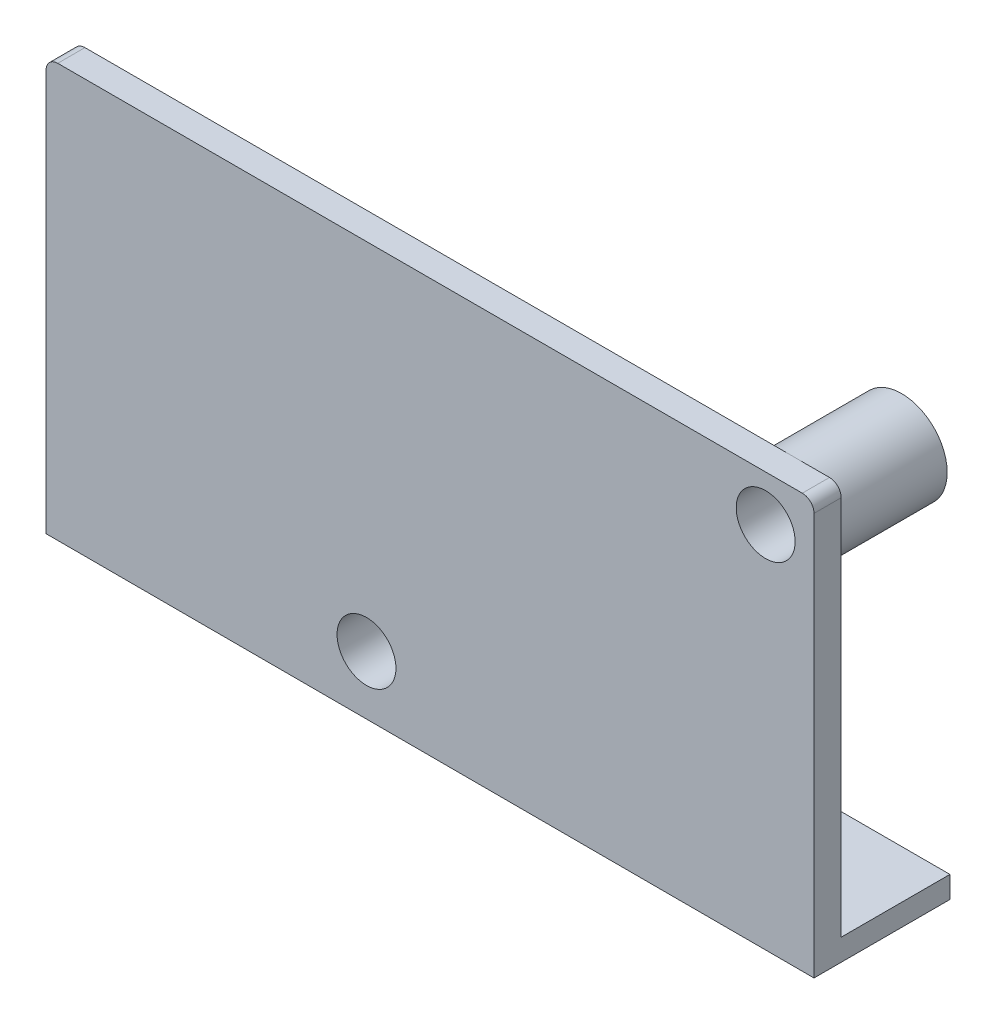
ISO-10303-21;
HEADER;
FILE_DESCRIPTION(('STEP AP214'),'2;1');
FILE_NAME('part.step','',(''),(''),'','','');
FILE_SCHEMA(('AUTOMOTIVE_DESIGN { 1 0 10303 214 1 1 1 1 }'));
ENDSEC;
DATA;
#1=APPLICATION_CONTEXT('core data for automotive mechanical design processes');
#2=APPLICATION_PROTOCOL_DEFINITION('international standard','automotive_design',2000,#1);
#3=PRODUCT_CONTEXT('',#1,'mechanical');
#4=PRODUCT('Part','Part','',(#3));
#5=PRODUCT_RELATED_PRODUCT_CATEGORY('part','',(#4));
#6=PRODUCT_DEFINITION_FORMATION('','',#4);
#7=PRODUCT_DEFINITION_CONTEXT('part definition',#1,'design');
#8=PRODUCT_DEFINITION('design','',#6,#7);
#9=PRODUCT_DEFINITION_SHAPE('','',#8);
#10=(LENGTH_UNIT() NAMED_UNIT(*) SI_UNIT(.MILLI.,.METRE.));
#11=(NAMED_UNIT(*) PLANE_ANGLE_UNIT() SI_UNIT($,.RADIAN.));
#12=(NAMED_UNIT(*) SI_UNIT($,.STERADIAN.) SOLID_ANGLE_UNIT());
#13=UNCERTAINTY_MEASURE_WITH_UNIT(LENGTH_MEASURE(1.E-05),#10,'distance_accuracy_value','');
#14=(GEOMETRIC_REPRESENTATION_CONTEXT(3) GLOBAL_UNCERTAINTY_ASSIGNED_CONTEXT((#13)) GLOBAL_UNIT_ASSIGNED_CONTEXT((#10,
#11,#12)) REPRESENTATION_CONTEXT('',''));
#15=CARTESIAN_POINT('',(0.,0.,0.));
#16=DIRECTION('',(0.,0.,1.));
#17=DIRECTION('',(1.,0.,0.));
#18=AXIS2_PLACEMENT_3D('',#15,#16,#17);
#19=CARTESIAN_POINT('',(-37.3701242161152,-9.39429744441578,-12.5));
#20=DIRECTION('',(0.,-1.,0.));
#21=DIRECTION('',(1.,0.,0.));
#22=AXIS2_PLACEMENT_3D('',#19,#20,#21);
#23=PLANE('',#22);
#24=DIRECTION('',(1.,0.,0.));
#25=VECTOR('',#24,1.);
#26=CARTESIAN_POINT('',(-37.3701242161152,-9.39429744441578,-12.5));
#27=LINE('',#26,#25);
#28=CARTESIAN_POINT('',(-5.50182376053479,-9.39429744441579,-12.5));
#29=VERTEX_POINT('',#28);
#30=CARTESIAN_POINT('',(33.2418757838848,-9.39429744441579,-12.5));
#31=VERTEX_POINT('',#30);
#32=EDGE_CURVE('E217',#29,#31,#27,.T.);
#33=ORIENTED_EDGE('',*,*,#32,.F.);
#34=DIRECTION('',(0.,0.,1.));
#35=VECTOR('',#34,1.);
#36=CARTESIAN_POINT('',(-5.50182376053479,-9.39429744441579,-12.5));
#37=LINE('',#36,#35);
#38=CARTESIAN_POINT('',(-5.50182376053479,-9.39429744441579,-2.5));
#39=VERTEX_POINT('',#38);
#40=EDGE_CURVE('E210',#29,#39,#37,.T.);
#41=ORIENTED_EDGE('',*,*,#40,.T.);
#42=DIRECTION('',(1.,0.,0.));
#43=VECTOR('',#42,1.);
#44=CARTESIAN_POINT('',(-37.3701242161152,-9.39429744441578,-2.5));
#45=LINE('',#44,#43);
#46=CARTESIAN_POINT('',(33.2418757838848,-9.39429744441579,-2.5));
#47=VERTEX_POINT('',#46);
#48=EDGE_CURVE('E228',#39,#47,#45,.T.);
#49=ORIENTED_EDGE('',*,*,#48,.T.);
#50=DIRECTION('',(0.,0.,1.));
#51=VECTOR('',#50,1.);
#52=CARTESIAN_POINT('',(33.2418757838848,-9.39429744441579,-12.5));
#53=LINE('',#52,#51);
#54=EDGE_CURVE('E236',#31,#47,#53,.T.);
#55=ORIENTED_EDGE('',*,*,#54,.F.);
#56=EDGE_LOOP('',(#33,#41,#49,#55));
#57=FACE_BOUND('',#56,.T.);
#58=ADVANCED_FACE('F35',(#57),#23,.F.);
#59=CARTESIAN_POINT('',(-36.2951962161152,25.6013105555092,-2.5));
#60=DIRECTION('',(0.,0.,1.));
#61=DIRECTION('',(1.,0.,0.));
#62=AXIS2_PLACEMENT_3D('',#59,#60,#61);
#63=CYLINDRICAL_SURFACE('',#62,1.07492800007502);
#64=CARTESIAN_POINT('',(-36.2951962161152,25.6013105555092,0.));
#65=DIRECTION('',(0.,0.,1.));
#66=DIRECTION('',(-1.,0.,0.));
#67=AXIS2_PLACEMENT_3D('',#64,#65,#66);
#68=CIRCLE('',#67,1.07492800007502);
#69=CARTESIAN_POINT('',(-36.2951962161152,26.6762385555842,0.));
#70=VERTEX_POINT('',#69);
#71=CARTESIAN_POINT('',(-37.3701242161152,25.6012978555842,0.));
#72=VERTEX_POINT('',#71);
#73=EDGE_CURVE('E149',#70,#72,#68,.T.);
#74=ORIENTED_EDGE('',*,*,#73,.F.);
#75=DIRECTION('',(0.,0.,1.));
#76=VECTOR('',#75,1.);
#77=CARTESIAN_POINT('',(-36.2951962161152,26.6762385555842,-2.5));
#78=LINE('',#77,#76);
#79=CARTESIAN_POINT('',(-36.2951962161152,26.6762385555842,-2.5));
#80=VERTEX_POINT('',#79);
#81=EDGE_CURVE('E11',#80,#70,#78,.T.);
#82=ORIENTED_EDGE('',*,*,#81,.F.);
#83=CARTESIAN_POINT('',(-36.2951962161152,25.6013105555092,-2.5));
#84=DIRECTION('',(0.,0.,1.));
#85=DIRECTION('',(-1.,0.,0.));
#86=AXIS2_PLACEMENT_3D('',#83,#84,#85);
#87=CIRCLE('',#86,1.07492800007502);
#88=CARTESIAN_POINT('',(-37.3701242161152,25.6012978555842,-2.5));
#89=VERTEX_POINT('',#88);
#90=EDGE_CURVE('E143',#80,#89,#87,.T.);
#91=ORIENTED_EDGE('',*,*,#90,.T.);
#92=DIRECTION('',(0.,0.,1.));
#93=VECTOR('',#92,1.);
#94=CARTESIAN_POINT('',(-37.3701242161152,25.6012978555842,-2.5));
#95=LINE('',#94,#93);
#96=EDGE_CURVE('E136',#89,#72,#95,.T.);
#97=ORIENTED_EDGE('',*,*,#96,.T.);
#98=EDGE_LOOP('',(#74,#82,#91,#97));
#99=FACE_BOUND('',#98,.T.);
#100=ADVANCED_FACE('F37',(#99),#63,.T.);
#101=CARTESIAN_POINT('',(-36.2951962161152,26.6762385555842,-2.5));
#102=DIRECTION('',(0.,1.,0.));
#103=DIRECTION('',(0.,0.,1.));
#104=AXIS2_PLACEMENT_3D('',#101,#102,#103);
#105=PLANE('',#104);
#106=ORIENTED_EDGE('',*,*,#81,.T.);
#107=DIRECTION('',(-1.,0.,0.));
#108=VECTOR('',#107,1.);
#109=CARTESIAN_POINT('',(-36.2951962161152,26.6762385555842,0.));
#110=LINE('',#109,#108);
#111=CARTESIAN_POINT('',(32.1669477838848,26.6762385555842,0.));
#112=VERTEX_POINT('',#111);
#113=EDGE_CURVE('E165',#112,#70,#110,.T.);
#114=ORIENTED_EDGE('',*,*,#113,.F.);
#115=DIRECTION('',(0.,0.,1.));
#116=VECTOR('',#115,1.);
#117=CARTESIAN_POINT('',(32.1669477838848,26.6762385555842,-2.5));
#118=LINE('',#117,#116);
#119=CARTESIAN_POINT('',(32.1669477838848,26.6762385555842,-2.5));
#120=VERTEX_POINT('',#119);
#121=EDGE_CURVE('E44',#120,#112,#118,.T.);
#122=ORIENTED_EDGE('',*,*,#121,.F.);
#123=DIRECTION('',(-1.,0.,0.));
#124=VECTOR('',#123,1.);
#125=CARTESIAN_POINT('',(-36.2951962161152,26.6762385555842,-2.5));
#126=LINE('',#125,#124);
#127=CARTESIAN_POINT('',(28.7968757838848,26.6762385555842,-2.5));
#128=VERTEX_POINT('',#127);
#129=EDGE_CURVE('E127',#120,#128,#126,.T.);
#130=ORIENTED_EDGE('',*,*,#129,.T.);
#131=EDGE_CURVE('E130',#128,#80,#126,.T.);
#132=ORIENTED_EDGE('',*,*,#131,.T.);
#133=EDGE_LOOP('',(#106,#114,#122,#130,#132));
#134=FACE_BOUND('',#133,.T.);
#135=ADVANCED_FACE('F129',(#134),#105,.T.);
#136=CARTESIAN_POINT('',(32.1669477838848,25.6013105555842,-2.5));
#137=DIRECTION('',(0.,0.,1.));
#138=DIRECTION('',(1.,0.,0.));
#139=AXIS2_PLACEMENT_3D('',#136,#137,#138);
#140=CYLINDRICAL_SURFACE('',#139,1.07492799999999);
#141=CARTESIAN_POINT('',(32.1669477838848,25.6013105555842,0.));
#142=DIRECTION('',(0.,0.,1.));
#143=DIRECTION('',(-1.,0.,0.));
#144=AXIS2_PLACEMENT_3D('',#141,#142,#143);
#145=CIRCLE('',#144,1.07492799999999);
#146=CARTESIAN_POINT('',(33.2418757838848,25.6013105555842,0.));
#147=VERTEX_POINT('',#146);
#148=EDGE_CURVE('E162',#147,#112,#145,.T.);
#149=ORIENTED_EDGE('',*,*,#148,.F.);
#150=DIRECTION('',(0.,0.,1.));
#151=VECTOR('',#150,1.);
#152=CARTESIAN_POINT('',(33.2418757838848,25.6013105555842,-2.5));
#153=LINE('',#152,#151);
#154=CARTESIAN_POINT('',(33.2418757838848,25.6013105555842,-2.5));
#155=VERTEX_POINT('',#154);
#156=EDGE_CURVE('E168',#155,#147,#153,.T.);
#157=ORIENTED_EDGE('',*,*,#156,.F.);
#158=CARTESIAN_POINT('',(32.1669477838848,25.6013105555842,-2.5));
#159=DIRECTION('',(0.,0.,1.));
#160=DIRECTION('',(-1.,0.,0.));
#161=AXIS2_PLACEMENT_3D('',#158,#159,#160);
#162=CIRCLE('',#161,1.07492799999999);
#163=EDGE_CURVE('E144',#155,#120,#162,.T.);
#164=ORIENTED_EDGE('',*,*,#163,.T.);
#165=ORIENTED_EDGE('',*,*,#121,.T.);
#166=EDGE_LOOP('',(#149,#157,#164,#165));
#167=FACE_BOUND('',#166,.T.);
#168=ADVANCED_FACE('F256',(#167),#140,.T.);
#169=CARTESIAN_POINT('',(33.2418757838848,25.6013105555842,-2.5));
#170=DIRECTION('',(1.,0.,0.));
#171=DIRECTION('',(0.,0.,-1.));
#172=AXIS2_PLACEMENT_3D('',#169,#170,#171);
#173=PLANE('',#172);
#174=DIRECTION('',(0.,1.,0.));
#175=VECTOR('',#174,1.);
#176=CARTESIAN_POINT('',(33.2418757838848,25.6013105555842,0.));
#177=LINE('',#176,#175);
#178=CARTESIAN_POINT('',(33.2418757838848,-11.3942974444158,0.));
#179=VERTEX_POINT('',#178);
#180=EDGE_CURVE('E159',#179,#147,#177,.T.);
#181=ORIENTED_EDGE('',*,*,#180,.F.);
#182=DIRECTION('',(0.,0.,1.));
#183=VECTOR('',#182,1.);
#184=CARTESIAN_POINT('',(33.2418757838848,-11.3942974444158,-2.5));
#185=LINE('',#184,#183);
#186=CARTESIAN_POINT('',(33.2418757838848,-11.3942974444158,-2.5));
#187=VERTEX_POINT('',#186);
#188=EDGE_CURVE('E170',#187,#179,#185,.T.);
#189=ORIENTED_EDGE('',*,*,#188,.F.);
#190=DIRECTION('',(0.,0.,1.));
#191=VECTOR('',#190,1.);
#192=CARTESIAN_POINT('',(33.2418757838848,-11.3942974444158,-12.5));
#193=LINE('',#192,#191);
#194=CARTESIAN_POINT('',(33.2418757838848,-11.3942974444158,-12.5));
#195=VERTEX_POINT('',#194);
#196=EDGE_CURVE('E233',#195,#187,#193,.T.);
#197=ORIENTED_EDGE('',*,*,#196,.F.);
#198=DIRECTION('',(0.,-1.,0.));
#199=VECTOR('',#198,1.);
#200=CARTESIAN_POINT('',(33.2418757838848,-9.39429744441579,-12.5));
#201=LINE('',#200,#199);
#202=EDGE_CURVE('E221',#31,#195,#201,.T.);
#203=ORIENTED_EDGE('',*,*,#202,.F.);
#204=ORIENTED_EDGE('',*,*,#54,.T.);
#205=DIRECTION('',(0.,1.,0.));
#206=VECTOR('',#205,1.);
#207=CARTESIAN_POINT('',(33.2418757838848,25.6013105555842,-2.5));
#208=LINE('',#207,#206);
#209=EDGE_CURVE('E145',#47,#155,#208,.T.);
#210=ORIENTED_EDGE('',*,*,#209,.T.);
#211=ORIENTED_EDGE('',*,*,#156,.T.);
#212=EDGE_LOOP('',(#181,#189,#197,#203,#204,#210,#211));
#213=FACE_BOUND('',#212,.T.);
#214=ADVANCED_FACE('F250',(#213),#173,.T.);
#215=CARTESIAN_POINT('',(-37.3701242161152,-11.3205612444158,-2.5));
#216=DIRECTION('',(-0.0010442440349705,-0.999999454777049,0.));
#217=DIRECTION('',(0.999999454777049,-0.0010442440349705,0.));
#218=AXIS2_PLACEMENT_3D('',#215,#216,#217);
#219=PLANE('',#218);
#220=DIRECTION('',(0.999999454777049,-0.0010442440349705,0.));
#221=VECTOR('',#220,1.);
#222=CARTESIAN_POINT('',(-37.3701242161152,-11.3205612444158,0.));
#223=LINE('',#222,#221);
#224=CARTESIAN_POINT('',(-37.3701242161152,-11.3205612444158,0.));
#225=VERTEX_POINT('',#224);
#226=EDGE_CURVE('E156',#225,#179,#223,.T.);
#227=ORIENTED_EDGE('',*,*,#226,.F.);
#228=DIRECTION('',(0.,0.,1.));
#229=VECTOR('',#228,1.);
#230=CARTESIAN_POINT('',(-37.3701242161152,-11.3205612444158,-2.5));
#231=LINE('',#230,#229);
#232=CARTESIAN_POINT('',(-37.3701242161152,-11.3205612444158,-2.5));
#233=VERTEX_POINT('',#232);
#234=EDGE_CURVE('E172',#233,#225,#231,.T.);
#235=ORIENTED_EDGE('',*,*,#234,.F.);
#236=DIRECTION('',(0.999999454777049,-0.0010442440349705,0.));
#237=VECTOR('',#236,1.);
#238=CARTESIAN_POINT('',(-37.3701242161152,-11.3205612444158,-2.5));
#239=LINE('',#238,#237);
#240=EDGE_CURVE('E244',#233,#187,#239,.T.);
#241=ORIENTED_EDGE('',*,*,#240,.T.);
#242=ORIENTED_EDGE('',*,*,#188,.T.);
#243=EDGE_LOOP('',(#227,#235,#241,#242));
#244=FACE_BOUND('',#243,.T.);
#245=ADVANCED_FACE('F264',(#244),#219,.T.);
#246=CARTESIAN_POINT('',(-37.3701242161152,-11.3205612444158,-2.5));
#247=DIRECTION('',(-1.,0.,0.));
#248=DIRECTION('',(0.,0.,1.));
#249=AXIS2_PLACEMENT_3D('',#246,#247,#248);
#250=PLANE('',#249);
#251=DIRECTION('',(0.,-1.,0.));
#252=VECTOR('',#251,1.);
#253=CARTESIAN_POINT('',(-37.3701242161152,-11.3205612444158,0.));
#254=LINE('',#253,#252);
#255=EDGE_CURVE('E152',#72,#225,#254,.T.);
#256=ORIENTED_EDGE('',*,*,#255,.F.);
#257=ORIENTED_EDGE('',*,*,#96,.F.);
#258=DIRECTION('',(0.,-1.,0.));
#259=VECTOR('',#258,1.);
#260=CARTESIAN_POINT('',(-37.3701242161152,-11.3205612444158,-2.5));
#261=LINE('',#260,#259);
#262=CARTESIAN_POINT('',(-37.3701242161152,-9.39429744441579,-2.5));
#263=VERTEX_POINT('',#262);
#264=EDGE_CURVE('E242',#89,#263,#261,.T.);
#265=ORIENTED_EDGE('',*,*,#264,.T.);
#266=DIRECTION('',(0.,0.,1.));
#267=VECTOR('',#266,1.);
#268=CARTESIAN_POINT('',(-37.3701242161152,-9.39429744441578,-12.5));
#269=LINE('',#268,#267);
#270=CARTESIAN_POINT('',(-37.3701242161152,-9.39429744441578,-12.5));
#271=VERTEX_POINT('',#270);
#272=EDGE_CURVE('E153',#271,#263,#269,.T.);
#273=ORIENTED_EDGE('',*,*,#272,.F.);
#274=DIRECTION('',(0.,1.,0.));
#275=VECTOR('',#274,1.);
#276=CARTESIAN_POINT('',(-37.3701242161152,-9.39429744441578,-12.5));
#277=LINE('',#276,#275);
#278=CARTESIAN_POINT('',(-37.3701242161152,-11.3942974444158,-12.5));
#279=VERTEX_POINT('',#278);
#280=EDGE_CURVE('E214',#279,#271,#277,.T.);
#281=ORIENTED_EDGE('',*,*,#280,.F.);
#282=DIRECTION('',(0.,0.,1.));
#283=VECTOR('',#282,1.);
#284=CARTESIAN_POINT('',(-37.3701242161152,-11.3942974444158,-12.5));
#285=LINE('',#284,#283);
#286=CARTESIAN_POINT('',(-37.3701242161152,-11.3942974444158,-2.5));
#287=VERTEX_POINT('',#286);
#288=EDGE_CURVE('E225',#279,#287,#285,.T.);
#289=ORIENTED_EDGE('',*,*,#288,.T.);
#290=DIRECTION('',(0.,1.,0.));
#291=VECTOR('',#290,1.);
#292=CARTESIAN_POINT('',(-37.3701242161152,-9.39429744441578,-2.5));
#293=LINE('',#292,#291);
#294=EDGE_CURVE('E213',#287,#233,#293,.T.);
#295=ORIENTED_EDGE('',*,*,#294,.T.);
#296=ORIENTED_EDGE('',*,*,#234,.T.);
#297=EDGE_LOOP('',(#256,#257,#265,#273,#281,#289,#295,#296));
#298=FACE_BOUND('',#297,.T.);
#299=ADVANCED_FACE('F274',(#298),#250,.T.);
#300=CARTESIAN_POINT('',(-36.2951962161152,25.6013105555092,-2.5));
#301=DIRECTION('',(0.,0.,-1.));
#302=DIRECTION('',(-1.,0.,0.));
#303=AXIS2_PLACEMENT_3D('',#300,#301,#302);
#304=PLANE('',#303);
#305=ORIENTED_EDGE('',*,*,#131,.F.);
#306=CARTESIAN_POINT('',(28.7968757838848,22.4852385555842,-2.5));
#307=DIRECTION('',(0.,0.,-1.));
#308=DIRECTION('',(-1.,0.,0.));
#309=AXIS2_PLACEMENT_3D('',#306,#307,#308);
#310=CIRCLE('',#309,4.191);
#311=EDGE_CURVE('E141',#128,#128,#310,.T.);
#312=ORIENTED_EDGE('',*,*,#311,.F.);
#313=ORIENTED_EDGE('',*,*,#129,.F.);
#314=ORIENTED_EDGE('',*,*,#163,.F.);
#315=ORIENTED_EDGE('',*,*,#209,.F.);
#316=ORIENTED_EDGE('',*,*,#48,.F.);
#317=CARTESIAN_POINT('',(-7.90612421611517,-5.96276144441579,-2.5));
#318=DIRECTION('',(0.,0.,-1.));
#319=DIRECTION('',(-1.,0.,0.));
#320=AXIS2_PLACEMENT_3D('',#317,#318,#319);
#321=CIRCLE('',#320,4.19);
#322=CARTESIAN_POINT('',(-10.3104246716956,-9.39429744441579,-2.5));
#323=VERTEX_POINT('',#322);
#324=EDGE_CURVE('E208',#323,#39,#321,.T.);
#325=ORIENTED_EDGE('',*,*,#324,.F.);
#326=EDGE_CURVE('E60',#263,#323,#45,.T.);
#327=ORIENTED_EDGE('',*,*,#326,.F.);
#328=ORIENTED_EDGE('',*,*,#264,.F.);
#329=ORIENTED_EDGE('',*,*,#90,.F.);
#330=EDGE_LOOP('',(#305,#312,#313,#314,#315,#316,#325,#327,#328,#329));
#331=FACE_BOUND('',#330,.T.);
#332=ADVANCED_FACE('F139',(#331),#304,.T.);
#333=CARTESIAN_POINT('',(-36.2951962161152,25.6013105555092,0.));
#334=DIRECTION('',(0.,0.,-1.));
#335=DIRECTION('',(-1.,0.,0.));
#336=AXIS2_PLACEMENT_3D('',#333,#334,#335);
#337=PLANE('',#336);
#338=CARTESIAN_POINT('',(-7.90612421611517,-5.96276144441579,0.));
#339=DIRECTION('',(0.,0.,1.));
#340=DIRECTION('',(1.,0.,0.));
#341=AXIS2_PLACEMENT_3D('',#338,#339,#340);
#342=CIRCLE('',#341,2.7083489);
#343=CARTESIAN_POINT('',(-5.19777531611517,-5.96276144441579,0.));
#344=VERTEX_POINT('',#343);
#345=EDGE_CURVE('E193',#344,#344,#342,.T.);
#346=ORIENTED_EDGE('',*,*,#345,.F.);
#347=EDGE_LOOP('',(#346));
#348=FACE_BOUND('',#347,.T.);
#349=CARTESIAN_POINT('',(28.7968757838848,22.4852385555842,0.));
#350=DIRECTION('',(0.,0.,1.));
#351=DIRECTION('',(1.,0.,0.));
#352=AXIS2_PLACEMENT_3D('',#349,#350,#351);
#353=CIRCLE('',#352,2.708349387292);
#354=CARTESIAN_POINT('',(31.5052251711768,22.4852385555842,0.));
#355=VERTEX_POINT('',#354);
#356=EDGE_CURVE('E188',#355,#355,#353,.T.);
#357=ORIENTED_EDGE('',*,*,#356,.F.);
#358=EDGE_LOOP('',(#357));
#359=FACE_BOUND('',#358,.T.);
#360=ORIENTED_EDGE('',*,*,#113,.T.);
#361=ORIENTED_EDGE('',*,*,#73,.T.);
#362=ORIENTED_EDGE('',*,*,#255,.T.);
#363=ORIENTED_EDGE('',*,*,#226,.T.);
#364=ORIENTED_EDGE('',*,*,#180,.T.);
#365=ORIENTED_EDGE('',*,*,#148,.T.);
#366=EDGE_LOOP('',(#360,#361,#362,#363,#364,#365));
#367=FACE_BOUND('',#366,.T.);
#368=ADVANCED_FACE('F258',(#348,#359,#367),#337,.F.);
#369=CARTESIAN_POINT('',(0.,0.,-2.5));
#370=DIRECTION('',(0.,0.,1.));
#371=DIRECTION('',(1.,0.,0.));
#372=AXIS2_PLACEMENT_3D('',#369,#370,#371);
#373=PLANE('',#372);
#374=ORIENTED_EDGE('',*,*,#240,.F.);
#375=ORIENTED_EDGE('',*,*,#294,.F.);
#376=DIRECTION('',(-1.,0.,0.));
#377=VECTOR('',#376,1.);
#378=CARTESIAN_POINT('',(-37.3701242161152,-11.3942974444158,-2.5));
#379=LINE('',#378,#377);
#380=EDGE_CURVE('E218',#187,#287,#379,.T.);
#381=ORIENTED_EDGE('',*,*,#380,.F.);
#382=EDGE_LOOP('',(#374,#375,#381));
#383=FACE_BOUND('',#382,.T.);
#384=ADVANCED_FACE('F271',(#383),#373,.T.);
#385=ORIENTED_EDGE('',*,*,#326,.T.);
#386=DIRECTION('',(0.,0.,1.));
#387=VECTOR('',#386,1.);
#388=CARTESIAN_POINT('',(-10.3104246716956,-9.39429744441579,-12.5));
#389=LINE('',#388,#387);
#390=CARTESIAN_POINT('',(-10.3104246716956,-9.39429744441579,-12.5));
#391=VERTEX_POINT('',#390);
#392=EDGE_CURVE('E205',#323,#391,#389,.F.);
#393=ORIENTED_EDGE('',*,*,#392,.T.);
#394=EDGE_CURVE('E219',#271,#391,#27,.T.);
#395=ORIENTED_EDGE('',*,*,#394,.F.);
#396=ORIENTED_EDGE('',*,*,#272,.T.);
#397=EDGE_LOOP('',(#385,#393,#395,#396));
#398=FACE_BOUND('',#397,.T.);
#399=ADVANCED_FACE('F282',(#398),#23,.F.);
#400=CARTESIAN_POINT('',(-37.3701242161152,-11.3942974444158,-12.5));
#401=DIRECTION('',(0.,1.,0.));
#402=DIRECTION('',(0.,0.,1.));
#403=AXIS2_PLACEMENT_3D('',#400,#401,#402);
#404=PLANE('',#403);
#405=ORIENTED_EDGE('',*,*,#380,.T.);
#406=ORIENTED_EDGE('',*,*,#288,.F.);
#407=DIRECTION('',(-1.,0.,0.));
#408=VECTOR('',#407,1.);
#409=CARTESIAN_POINT('',(-37.3701242161152,-11.3942974444158,-12.5));
#410=LINE('',#409,#408);
#411=EDGE_CURVE('E223',#195,#279,#410,.T.);
#412=ORIENTED_EDGE('',*,*,#411,.F.);
#413=ORIENTED_EDGE('',*,*,#196,.T.);
#414=EDGE_LOOP('',(#405,#406,#412,#413));
#415=FACE_BOUND('',#414,.T.);
#416=ADVANCED_FACE('F269',(#415),#404,.F.);
#417=CARTESIAN_POINT('',(0.,0.,-12.5));
#418=DIRECTION('',(0.,0.,1.));
#419=DIRECTION('',(1.,0.,0.));
#420=AXIS2_PLACEMENT_3D('',#417,#418,#419);
#421=PLANE('',#420);
#422=CARTESIAN_POINT('',(-7.90612421611517,-5.96276144441579,-12.5));
#423=DIRECTION('',(0.,0.,1.));
#424=DIRECTION('',(1.,0.,0.));
#425=AXIS2_PLACEMENT_3D('',#422,#423,#424);
#426=CIRCLE('',#425,1.65);
#427=CARTESIAN_POINT('',(-6.25612421611517,-5.96276144441579,-12.5));
#428=VERTEX_POINT('',#427);
#429=EDGE_CURVE('E176',#428,#428,#426,.T.);
#430=ORIENTED_EDGE('',*,*,#429,.T.);
#431=EDGE_LOOP('',(#430));
#432=FACE_BOUND('',#431,.T.);
#433=ORIENTED_EDGE('',*,*,#394,.T.);
#434=CARTESIAN_POINT('',(-7.90612421611517,-5.96276144441579,-12.5));
#435=DIRECTION('',(0.,0.,1.));
#436=DIRECTION('',(1.,0.,0.));
#437=AXIS2_PLACEMENT_3D('',#434,#435,#436);
#438=CIRCLE('',#437,4.19);
#439=EDGE_CURVE('E52',#29,#391,#438,.T.);
#440=ORIENTED_EDGE('',*,*,#439,.F.);
#441=ORIENTED_EDGE('',*,*,#32,.T.);
#442=ORIENTED_EDGE('',*,*,#202,.T.);
#443=ORIENTED_EDGE('',*,*,#411,.T.);
#444=ORIENTED_EDGE('',*,*,#280,.T.);
#445=EDGE_LOOP('',(#433,#440,#441,#442,#443,#444));
#446=FACE_BOUND('',#445,.T.);
#447=ADVANCED_FACE('F277',(#432,#446),#421,.F.);
#448=CARTESIAN_POINT('',(-7.90612421611517,-5.96276144441579,-12.5));
#449=DIRECTION('',(0.,0.,1.));
#450=DIRECTION('',(1.,0.,0.));
#451=AXIS2_PLACEMENT_3D('',#448,#449,#450);
#452=CYLINDRICAL_SURFACE('',#451,4.19);
#453=ORIENTED_EDGE('',*,*,#40,.F.);
#454=ORIENTED_EDGE('',*,*,#439,.T.);
#455=ORIENTED_EDGE('',*,*,#392,.F.);
#456=ORIENTED_EDGE('',*,*,#324,.T.);
#457=EDGE_LOOP('',(#453,#454,#455,#456));
#458=FACE_BOUND('',#457,.T.);
#459=ADVANCED_FACE('F283',(#458),#452,.T.);
#460=CARTESIAN_POINT('',(28.7968757838848,22.4852385555842,-12.5));
#461=DIRECTION('',(0.,0.,1.));
#462=DIRECTION('',(1.,0.,0.));
#463=AXIS2_PLACEMENT_3D('',#460,#461,#462);
#464=CYLINDRICAL_SURFACE('',#463,4.191);
#465=ORIENTED_EDGE('',*,*,#311,.T.);
#466=EDGE_LOOP('',(#465));
#467=FACE_BOUND('',#466,.T.);
#468=CARTESIAN_POINT('',(28.7968757838848,22.4852385555842,-12.5));
#469=DIRECTION('',(0.,0.,1.));
#470=DIRECTION('',(1.,0.,0.));
#471=AXIS2_PLACEMENT_3D('',#468,#469,#470);
#472=CIRCLE('',#471,4.191);
#473=CARTESIAN_POINT('',(32.9878757838848,22.4852385555842,-12.5));
#474=VERTEX_POINT('',#473);
#475=EDGE_CURVE('E192',#474,#474,#472,.T.);
#476=ORIENTED_EDGE('',*,*,#475,.T.);
#477=EDGE_LOOP('',(#476));
#478=FACE_BOUND('',#477,.T.);
#479=ADVANCED_FACE('F285',(#467,#478),#464,.T.);
#480=CARTESIAN_POINT('',(28.7968757838848,22.4852385555842,-12.5));
#481=DIRECTION('',(0.,0.,1.));
#482=DIRECTION('',(1.,0.,0.));
#483=AXIS2_PLACEMENT_3D('',#480,#481,#482);
#484=PLANE('',#483);
#485=CARTESIAN_POINT('',(28.7968757838848,22.4852385555842,-12.5));
#486=DIRECTION('',(0.,0.,1.));
#487=DIRECTION('',(1.,0.,0.));
#488=AXIS2_PLACEMENT_3D('',#485,#486,#487);
#489=CIRCLE('',#488,1.65);
#490=CARTESIAN_POINT('',(30.4468757838848,22.4852385555842,-12.5));
#491=VERTEX_POINT('',#490);
#492=EDGE_CURVE('E184',#491,#491,#489,.T.);
#493=ORIENTED_EDGE('',*,*,#492,.T.);
#494=EDGE_LOOP('',(#493));
#495=FACE_BOUND('',#494,.T.);
#496=ORIENTED_EDGE('',*,*,#475,.F.);
#497=EDGE_LOOP('',(#496));
#498=FACE_BOUND('',#497,.T.);
#499=ADVANCED_FACE('F291',(#495,#498),#484,.F.);
#500=CARTESIAN_POINT('',(28.7968757838848,22.4852385555842,-10.5));
#501=DIRECTION('',(0.,0.,1.));
#502=DIRECTION('',(1.,0.,0.));
#503=AXIS2_PLACEMENT_3D('',#500,#501,#502);
#504=CYLINDRICAL_SURFACE('',#503,2.708349387292);
#505=CARTESIAN_POINT('',(28.7968757838848,22.4852385555842,-10.5));
#506=DIRECTION('',(0.,0.,1.));
#507=DIRECTION('',(1.,0.,0.));
#508=AXIS2_PLACEMENT_3D('',#505,#506,#507);
#509=CIRCLE('',#508,2.708349387292);
#510=CARTESIAN_POINT('',(31.5052251711768,22.4852385555842,-10.5));
#511=VERTEX_POINT('',#510);
#512=EDGE_CURVE('E196',#511,#511,#509,.T.);
#513=CARTESIAN_POINT('',(31.5052251711768,22.4852385555842,-10.5));
#514=CARTESIAN_POINT('',(31.5052251711768,22.4852385555842,-10.390625));
#515=CARTESIAN_POINT('',(31.5052251711768,22.4852385555842,-10.28125));
#516=CARTESIAN_POINT('',(31.5052251711768,22.4852385555842,-10.0625));
#517=CARTESIAN_POINT('',(31.5052251711768,22.4852385555842,-9.953125));
#518=CARTESIAN_POINT('',(31.5052251711768,22.4852385555842,-9.734375));
#519=CARTESIAN_POINT('',(31.5052251711768,22.4852385555842,-9.625));
#520=CARTESIAN_POINT('',(31.5052251711768,22.4852385555842,-9.40625));
#521=CARTESIAN_POINT('',(31.5052251711768,22.4852385555842,-9.296875));
#522=CARTESIAN_POINT('',(31.5052251711768,22.4852385555842,-9.078125));
#523=CARTESIAN_POINT('',(31.5052251711768,22.4852385555842,-8.96875));
#524=CARTESIAN_POINT('',(31.5052251711768,22.4852385555842,-8.75));
#525=CARTESIAN_POINT('',(31.5052251711768,22.4852385555842,-8.640625));
#526=CARTESIAN_POINT('',(31.5052251711768,22.4852385555842,-8.421875));
#527=CARTESIAN_POINT('',(31.5052251711768,22.4852385555842,-8.3125));
#528=CARTESIAN_POINT('',(31.5052251711768,22.4852385555842,-8.09375));
#529=CARTESIAN_POINT('',(31.5052251711768,22.4852385555842,-7.984375));
#530=CARTESIAN_POINT('',(31.5052251711768,22.4852385555842,-7.765625));
#531=CARTESIAN_POINT('',(31.5052251711768,22.4852385555842,-7.65625));
#532=CARTESIAN_POINT('',(31.5052251711768,22.4852385555842,-7.4375));
#533=CARTESIAN_POINT('',(31.5052251711768,22.4852385555842,-7.328125));
#534=CARTESIAN_POINT('',(31.5052251711768,22.4852385555842,-7.109375));
#535=CARTESIAN_POINT('',(31.5052251711768,22.4852385555842,-7.));
#536=CARTESIAN_POINT('',(31.5052251711768,22.4852385555842,-6.78125));
#537=CARTESIAN_POINT('',(31.5052251711768,22.4852385555842,-6.671875));
#538=CARTESIAN_POINT('',(31.5052251711768,22.4852385555842,-6.453125));
#539=CARTESIAN_POINT('',(31.5052251711768,22.4852385555842,-6.34375));
#540=CARTESIAN_POINT('',(31.5052251711768,22.4852385555842,-6.125));
#541=CARTESIAN_POINT('',(31.5052251711768,22.4852385555842,-6.015625));
#542=CARTESIAN_POINT('',(31.5052251711768,22.4852385555842,-5.796875));
#543=CARTESIAN_POINT('',(31.5052251711768,22.4852385555842,-5.6875));
#544=CARTESIAN_POINT('',(31.5052251711768,22.4852385555842,-5.46875));
#545=CARTESIAN_POINT('',(31.5052251711768,22.4852385555842,-5.359375));
#546=CARTESIAN_POINT('',(31.5052251711768,22.4852385555842,-5.140625));
#547=CARTESIAN_POINT('',(31.5052251711768,22.4852385555842,-5.03125));
#548=CARTESIAN_POINT('',(31.5052251711768,22.4852385555842,-4.8125));
#549=CARTESIAN_POINT('',(31.5052251711768,22.4852385555842,-4.703125));
#550=CARTESIAN_POINT('',(31.5052251711768,22.4852385555842,-4.484375));
#551=CARTESIAN_POINT('',(31.5052251711768,22.4852385555842,-4.375));
#552=CARTESIAN_POINT('',(31.5052251711768,22.4852385555842,-4.15625));
#553=CARTESIAN_POINT('',(31.5052251711768,22.4852385555842,-4.046875));
#554=CARTESIAN_POINT('',(31.5052251711768,22.4852385555842,-3.828125));
#555=CARTESIAN_POINT('',(31.5052251711768,22.4852385555842,-3.71875));
#556=CARTESIAN_POINT('',(31.5052251711768,22.4852385555842,-3.5));
#557=CARTESIAN_POINT('',(31.5052251711768,22.4852385555842,-3.390625));
#558=CARTESIAN_POINT('',(31.5052251711768,22.4852385555842,-3.171875));
#559=CARTESIAN_POINT('',(31.5052251711768,22.4852385555842,-3.0625));
#560=CARTESIAN_POINT('',(31.5052251711768,22.4852385555842,-2.84375));
#561=CARTESIAN_POINT('',(31.5052251711768,22.4852385555842,-2.734375));
#562=CARTESIAN_POINT('',(31.5052251711768,22.4852385555842,-2.515625));
#563=CARTESIAN_POINT('',(31.5052251711768,22.4852385555842,-2.40625));
#564=CARTESIAN_POINT('',(31.5052251711768,22.4852385555842,-2.1875));
#565=CARTESIAN_POINT('',(31.5052251711768,22.4852385555842,-2.078125));
#566=CARTESIAN_POINT('',(31.5052251711768,22.4852385555842,-1.859375));
#567=CARTESIAN_POINT('',(31.5052251711768,22.4852385555842,-1.75));
#568=CARTESIAN_POINT('',(31.5052251711768,22.4852385555842,-1.53125));
#569=CARTESIAN_POINT('',(31.5052251711768,22.4852385555842,-1.421875));
#570=CARTESIAN_POINT('',(31.5052251711768,22.4852385555842,-1.203125));
#571=CARTESIAN_POINT('',(31.5052251711768,22.4852385555842,-1.09375));
#572=CARTESIAN_POINT('',(31.5052251711768,22.4852385555842,-0.875000000000001));
#573=CARTESIAN_POINT('',(31.5052251711768,22.4852385555842,-0.765625000000001));
#574=CARTESIAN_POINT('',(31.5052251711768,22.4852385555842,-0.546875));
#575=CARTESIAN_POINT('',(31.5052251711768,22.4852385555842,-0.4375));
#576=CARTESIAN_POINT('',(31.5052251711768,22.4852385555842,-0.21875));
#577=CARTESIAN_POINT('',(31.5052251711768,22.4852385555842,-0.109375));
#578=CARTESIAN_POINT('',(31.5052251711768,22.4852385555842,0.));
#579=B_SPLINE_CURVE_WITH_KNOTS('',3,(#513,#514,#515,#516,#517,#518,#519,#520,#521,#522,#523,
#524,#525,#526,#527,#528,#529,#530,#531,#532,#533,#534,#535,#536,#537,#538,#539,#540,#541,#542,
#543,#544,#545,#546,#547,#548,#549,#550,#551,#552,#553,#554,#555,#556,#557,#558,#559,#560,#561,
#562,#563,#564,#565,#566,#567,#568,#569,#570,#571,#572,#573,#574,#575,#576,#577,#578),
.UNSPECIFIED.,.F.,.F.,(4,2,2,2,2,2,2,2,2,2,2,2,2,2,2,2,2,2,2,2,2,2,2,2,2,2,2,2,2,2,2,2,4),(0.,
0.328124999999999,0.656249999999999,0.984374999999999,1.3125,1.640625,1.96875,2.296875,2.625,
2.953125,3.28125,3.609375,3.9375,4.265625,4.59375,4.921875,5.25,5.578125,5.90625,6.234375,
6.5625,6.890625,7.21875,7.546875,7.875,8.203125,8.53125,8.859375,9.1875,9.515625,9.84375,
10.171875,10.5),.UNSPECIFIED.);
#580=EDGE_CURVE('BSEAM369',#511,#355,#579,.T.);
#581=ORIENTED_EDGE('',*,*,#512,.F.);
#582=ORIENTED_EDGE('',*,*,#356,.T.);
#583=ORIENTED_EDGE('',*,*,#580,.T.);
#584=ORIENTED_EDGE('',*,*,#580,.F.);
#585=EDGE_LOOP('',(#581,#583,#582,#584));
#586=FACE_BOUND('',#585,.T.);
#587=ADVANCED_FACE('F369',(#586),#504,.F.);
#588=CARTESIAN_POINT('',(28.7968757838848,22.4852385555842,-10.5));
#589=DIRECTION('',(0.,0.,1.));
#590=DIRECTION('',(1.,0.,0.));
#591=AXIS2_PLACEMENT_3D('',#588,#589,#590);
#592=PLANE('',#591);
#593=CARTESIAN_POINT('',(28.7968757838848,22.4852385555842,-10.5));
#594=DIRECTION('',(0.,0.,1.));
#595=DIRECTION('',(1.,0.,0.));
#596=AXIS2_PLACEMENT_3D('',#593,#594,#595);
#597=CIRCLE('',#596,1.65);
#598=CARTESIAN_POINT('',(30.4468757838848,22.4852385555842,-10.5));
#599=VERTEX_POINT('',#598);
#600=EDGE_CURVE('E39',#599,#599,#597,.T.);
#601=ORIENTED_EDGE('',*,*,#600,.F.);
#602=EDGE_LOOP('',(#601));
#603=FACE_BOUND('',#602,.T.);
#604=ORIENTED_EDGE('',*,*,#512,.T.);
#605=EDGE_LOOP('',(#604));
#606=FACE_BOUND('',#605,.T.);
#607=ADVANCED_FACE('F374',(#603,#606),#592,.T.);
#608=CARTESIAN_POINT('',(-7.90612421611517,-5.96276144441579,-10.5));
#609=DIRECTION('',(0.,0.,1.));
#610=DIRECTION('',(1.,0.,0.));
#611=AXIS2_PLACEMENT_3D('',#608,#609,#610);
#612=CYLINDRICAL_SURFACE('',#611,2.7083489);
#613=CARTESIAN_POINT('',(-7.90612421611517,-5.96276144441579,-10.5));
#614=DIRECTION('',(0.,0.,1.));
#615=DIRECTION('',(1.,0.,0.));
#616=AXIS2_PLACEMENT_3D('',#613,#614,#615);
#617=CIRCLE('',#616,2.7083489);
#618=CARTESIAN_POINT('',(-5.19777531611517,-5.96276144441579,-10.5));
#619=VERTEX_POINT('',#618);
#620=EDGE_CURVE('E189',#619,#619,#617,.T.);
#621=CARTESIAN_POINT('',(-5.19777531611517,-5.96276144441579,-10.5));
#622=CARTESIAN_POINT('',(-5.19777531611517,-5.96276144441579,-10.390625));
#623=CARTESIAN_POINT('',(-5.19777531611517,-5.96276144441579,-10.28125));
#624=CARTESIAN_POINT('',(-5.19777531611517,-5.96276144441579,-10.0625));
#625=CARTESIAN_POINT('',(-5.19777531611517,-5.96276144441579,-9.953125));
#626=CARTESIAN_POINT('',(-5.19777531611517,-5.96276144441579,-9.734375));
#627=CARTESIAN_POINT('',(-5.19777531611517,-5.96276144441579,-9.625));
#628=CARTESIAN_POINT('',(-5.19777531611517,-5.96276144441579,-9.40625));
#629=CARTESIAN_POINT('',(-5.19777531611517,-5.96276144441579,-9.296875));
#630=CARTESIAN_POINT('',(-5.19777531611517,-5.96276144441579,-9.078125));
#631=CARTESIAN_POINT('',(-5.19777531611517,-5.96276144441579,-8.96875));
#632=CARTESIAN_POINT('',(-5.19777531611517,-5.96276144441579,-8.75));
#633=CARTESIAN_POINT('',(-5.19777531611517,-5.96276144441579,-8.640625));
#634=CARTESIAN_POINT('',(-5.19777531611517,-5.96276144441579,-8.421875));
#635=CARTESIAN_POINT('',(-5.19777531611517,-5.96276144441579,-8.3125));
#636=CARTESIAN_POINT('',(-5.19777531611517,-5.96276144441579,-8.09375));
#637=CARTESIAN_POINT('',(-5.19777531611517,-5.96276144441579,-7.984375));
#638=CARTESIAN_POINT('',(-5.19777531611517,-5.96276144441579,-7.765625));
#639=CARTESIAN_POINT('',(-5.19777531611517,-5.96276144441579,-7.65625));
#640=CARTESIAN_POINT('',(-5.19777531611517,-5.96276144441579,-7.4375));
#641=CARTESIAN_POINT('',(-5.19777531611517,-5.96276144441579,-7.328125));
#642=CARTESIAN_POINT('',(-5.19777531611517,-5.96276144441579,-7.109375));
#643=CARTESIAN_POINT('',(-5.19777531611517,-5.96276144441579,-7.));
#644=CARTESIAN_POINT('',(-5.19777531611517,-5.96276144441579,-6.78125));
#645=CARTESIAN_POINT('',(-5.19777531611517,-5.96276144441579,-6.671875));
#646=CARTESIAN_POINT('',(-5.19777531611517,-5.96276144441579,-6.453125));
#647=CARTESIAN_POINT('',(-5.19777531611517,-5.96276144441579,-6.34375));
#648=CARTESIAN_POINT('',(-5.19777531611517,-5.96276144441579,-6.125));
#649=CARTESIAN_POINT('',(-5.19777531611517,-5.96276144441579,-6.015625));
#650=CARTESIAN_POINT('',(-5.19777531611517,-5.96276144441579,-5.796875));
#651=CARTESIAN_POINT('',(-5.19777531611517,-5.96276144441579,-5.6875));
#652=CARTESIAN_POINT('',(-5.19777531611517,-5.96276144441579,-5.46875));
#653=CARTESIAN_POINT('',(-5.19777531611517,-5.96276144441579,-5.359375));
#654=CARTESIAN_POINT('',(-5.19777531611517,-5.96276144441579,-5.140625));
#655=CARTESIAN_POINT('',(-5.19777531611517,-5.96276144441579,-5.03125));
#656=CARTESIAN_POINT('',(-5.19777531611517,-5.96276144441579,-4.8125));
#657=CARTESIAN_POINT('',(-5.19777531611517,-5.96276144441579,-4.703125));
#658=CARTESIAN_POINT('',(-5.19777531611517,-5.96276144441579,-4.484375));
#659=CARTESIAN_POINT('',(-5.19777531611517,-5.96276144441579,-4.375));
#660=CARTESIAN_POINT('',(-5.19777531611517,-5.96276144441579,-4.15625));
#661=CARTESIAN_POINT('',(-5.19777531611517,-5.96276144441579,-4.046875));
#662=CARTESIAN_POINT('',(-5.19777531611517,-5.96276144441579,-3.828125));
#663=CARTESIAN_POINT('',(-5.19777531611517,-5.96276144441579,-3.71875));
#664=CARTESIAN_POINT('',(-5.19777531611517,-5.96276144441579,-3.5));
#665=CARTESIAN_POINT('',(-5.19777531611517,-5.96276144441579,-3.390625));
#666=CARTESIAN_POINT('',(-5.19777531611517,-5.96276144441579,-3.171875));
#667=CARTESIAN_POINT('',(-5.19777531611517,-5.96276144441579,-3.0625));
#668=CARTESIAN_POINT('',(-5.19777531611517,-5.96276144441579,-2.84375));
#669=CARTESIAN_POINT('',(-5.19777531611517,-5.96276144441579,-2.734375));
#670=CARTESIAN_POINT('',(-5.19777531611517,-5.96276144441579,-2.515625));
#671=CARTESIAN_POINT('',(-5.19777531611517,-5.96276144441579,-2.40625));
#672=CARTESIAN_POINT('',(-5.19777531611517,-5.96276144441579,-2.1875));
#673=CARTESIAN_POINT('',(-5.19777531611517,-5.96276144441579,-2.078125));
#674=CARTESIAN_POINT('',(-5.19777531611517,-5.96276144441579,-1.859375));
#675=CARTESIAN_POINT('',(-5.19777531611517,-5.96276144441579,-1.75));
#676=CARTESIAN_POINT('',(-5.19777531611517,-5.96276144441579,-1.53125));
#677=CARTESIAN_POINT('',(-5.19777531611517,-5.96276144441579,-1.421875));
#678=CARTESIAN_POINT('',(-5.19777531611517,-5.96276144441579,-1.203125));
#679=CARTESIAN_POINT('',(-5.19777531611517,-5.96276144441579,-1.09375));
#680=CARTESIAN_POINT('',(-5.19777531611517,-5.96276144441579,-0.875000000000001));
#681=CARTESIAN_POINT('',(-5.19777531611517,-5.96276144441579,-0.765625000000001));
#682=CARTESIAN_POINT('',(-5.19777531611517,-5.96276144441579,-0.546875));
#683=CARTESIAN_POINT('',(-5.19777531611517,-5.96276144441579,-0.4375));
#684=CARTESIAN_POINT('',(-5.19777531611517,-5.96276144441579,-0.21875));
#685=CARTESIAN_POINT('',(-5.19777531611517,-5.96276144441579,-0.109375));
#686=CARTESIAN_POINT('',(-5.19777531611517,-5.96276144441579,0.));
#687=B_SPLINE_CURVE_WITH_KNOTS('',3,(#621,#622,#623,#624,#625,#626,#627,#628,#629,#630,#631,
#632,#633,#634,#635,#636,#637,#638,#639,#640,#641,#642,#643,#644,#645,#646,#647,#648,#649,#650,
#651,#652,#653,#654,#655,#656,#657,#658,#659,#660,#661,#662,#663,#664,#665,#666,#667,#668,#669,
#670,#671,#672,#673,#674,#675,#676,#677,#678,#679,#680,#681,#682,#683,#684,#685,#686),
.UNSPECIFIED.,.F.,.F.,(4,2,2,2,2,2,2,2,2,2,2,2,2,2,2,2,2,2,2,2,2,2,2,2,2,2,2,2,2,2,2,2,4),(0.,
0.328124999999999,0.656249999999999,0.984374999999999,1.3125,1.640625,1.96875,2.296875,2.625,
2.953125,3.28125,3.609375,3.9375,4.265625,4.59375,4.921875,5.25,5.578125,5.90625,6.234375,
6.5625,6.890625,7.21875,7.546875,7.875,8.203125,8.53125,8.859375,9.1875,9.515625,9.84375,
10.171875,10.5),.UNSPECIFIED.);
#688=EDGE_CURVE('BSEAM382',#619,#344,#687,.T.);
#689=ORIENTED_EDGE('',*,*,#620,.F.);
#690=ORIENTED_EDGE('',*,*,#345,.T.);
#691=ORIENTED_EDGE('',*,*,#688,.T.);
#692=ORIENTED_EDGE('',*,*,#688,.F.);
#693=EDGE_LOOP('',(#689,#691,#690,#692));
#694=FACE_BOUND('',#693,.T.);
#695=ADVANCED_FACE('F382',(#694),#612,.F.);
#696=CARTESIAN_POINT('',(-7.90612421611517,-5.96276144441579,-10.5));
#697=DIRECTION('',(0.,0.,1.));
#698=DIRECTION('',(1.,0.,0.));
#699=AXIS2_PLACEMENT_3D('',#696,#697,#698);
#700=PLANE('',#699);
#701=CARTESIAN_POINT('',(-7.90612421611517,-5.96276144441579,-10.5));
#702=DIRECTION('',(0.,0.,1.));
#703=DIRECTION('',(1.,0.,0.));
#704=AXIS2_PLACEMENT_3D('',#701,#702,#703);
#705=CIRCLE('',#704,1.65);
#706=CARTESIAN_POINT('',(-6.25612421611517,-5.96276144441579,-10.5));
#707=VERTEX_POINT('',#706);
#708=EDGE_CURVE('E174',#707,#707,#705,.T.);
#709=ORIENTED_EDGE('',*,*,#708,.F.);
#710=EDGE_LOOP('',(#709));
#711=FACE_BOUND('',#710,.T.);
#712=ORIENTED_EDGE('',*,*,#620,.T.);
#713=EDGE_LOOP('',(#712));
#714=FACE_BOUND('',#713,.T.);
#715=ADVANCED_FACE('F387',(#711,#714),#700,.T.);
#716=CARTESIAN_POINT('',(-7.90612421611517,-5.96276144441579,0.));
#717=DIRECTION('',(0.,0.,-1.));
#718=DIRECTION('',(-1.,0.,0.));
#719=AXIS2_PLACEMENT_3D('',#716,#717,#718);
#720=CYLINDRICAL_SURFACE('',#719,1.65);
#721=ORIENTED_EDGE('',*,*,#708,.T.);
#722=EDGE_LOOP('',(#721));
#723=FACE_BOUND('',#722,.T.);
#724=ORIENTED_EDGE('',*,*,#429,.F.);
#725=EDGE_LOOP('',(#724));
#726=FACE_BOUND('',#725,.T.);
#727=ADVANCED_FACE('F418',(#723,#726),#720,.F.);
#728=CARTESIAN_POINT('',(28.7968757838848,22.4852385555842,0.));
#729=DIRECTION('',(0.,0.,-1.));
#730=DIRECTION('',(-1.,0.,0.));
#731=AXIS2_PLACEMENT_3D('',#728,#729,#730);
#732=CYLINDRICAL_SURFACE('',#731,1.65);
#733=ORIENTED_EDGE('',*,*,#600,.T.);
#734=EDGE_LOOP('',(#733));
#735=FACE_BOUND('',#734,.T.);
#736=ORIENTED_EDGE('',*,*,#492,.F.);
#737=EDGE_LOOP('',(#736));
#738=FACE_BOUND('',#737,.T.);
#739=ADVANCED_FACE('F428',(#735,#738),#732,.F.);
#740=CLOSED_SHELL('',(#58,#100,#135,#168,#214,#245,#299,#332,#368,#384,#399,#416,#447,#459,#479,
#499,#587,#607,#695,#715,#727,#739));
#741=MANIFOLD_SOLID_BREP('B2',#740);
#742=ADVANCED_BREP_SHAPE_REPRESENTATION('',(#18,#741),#14);
#743=SHAPE_DEFINITION_REPRESENTATION(#9,#742);
ENDSEC;
END-ISO-10303-21;
